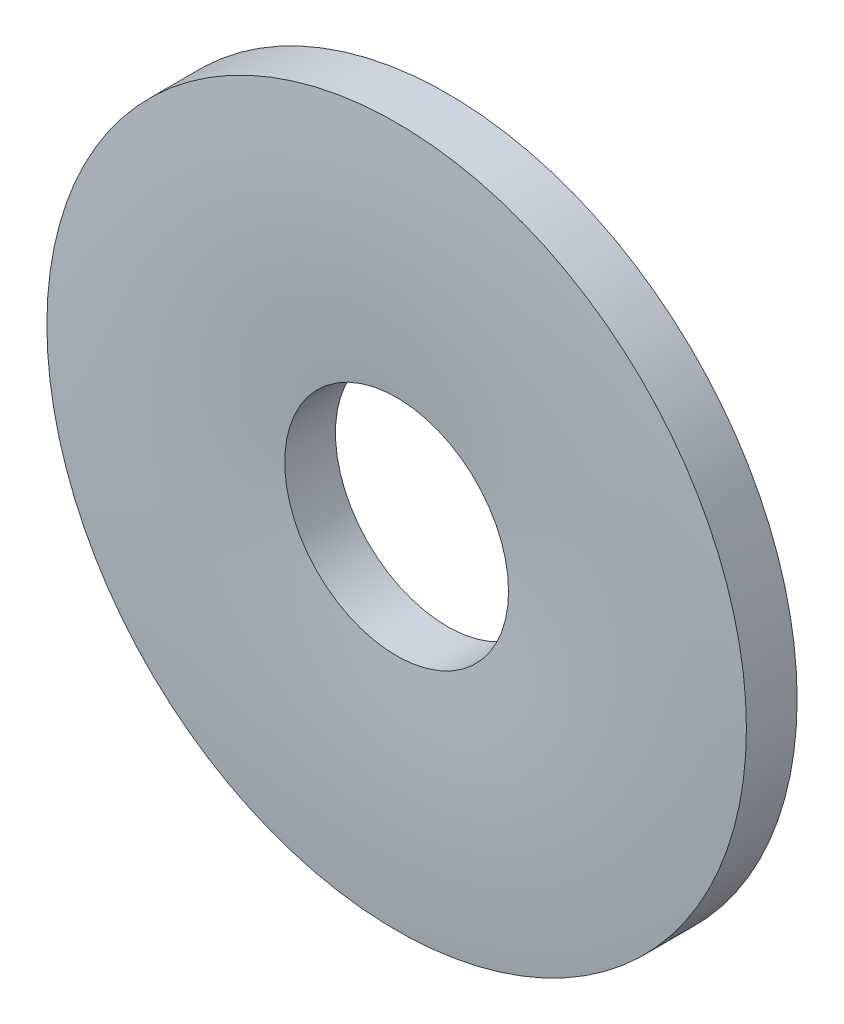
ISO-10303-21;
HEADER;
FILE_DESCRIPTION(('STEP AP214'),'2;1');
FILE_NAME('part.step','',(''),(''),'','','');
FILE_SCHEMA(('AUTOMOTIVE_DESIGN { 1 0 10303 214 1 1 1 1 }'));
ENDSEC;
DATA;
#1=APPLICATION_CONTEXT('core data for automotive mechanical design processes');
#2=APPLICATION_PROTOCOL_DEFINITION('international standard','automotive_design',2000,#1);
#3=PRODUCT_CONTEXT('',#1,'mechanical');
#4=PRODUCT('Part','Part','',(#3));
#5=PRODUCT_RELATED_PRODUCT_CATEGORY('part','',(#4));
#6=PRODUCT_DEFINITION_FORMATION('','',#4);
#7=PRODUCT_DEFINITION_CONTEXT('part definition',#1,'design');
#8=PRODUCT_DEFINITION('design','',#6,#7);
#9=PRODUCT_DEFINITION_SHAPE('','',#8);
#10=(LENGTH_UNIT() NAMED_UNIT(*) SI_UNIT(.MILLI.,.METRE.));
#11=(NAMED_UNIT(*) PLANE_ANGLE_UNIT() SI_UNIT($,.RADIAN.));
#12=(NAMED_UNIT(*) SI_UNIT($,.STERADIAN.) SOLID_ANGLE_UNIT());
#13=UNCERTAINTY_MEASURE_WITH_UNIT(LENGTH_MEASURE(1.E-05),#10,'distance_accuracy_value','');
#14=(GEOMETRIC_REPRESENTATION_CONTEXT(3) GLOBAL_UNCERTAINTY_ASSIGNED_CONTEXT((#13)) GLOBAL_UNIT_ASSIGNED_CONTEXT((#10,
#11,#12)) REPRESENTATION_CONTEXT('',''));
#15=CARTESIAN_POINT('',(0.,0.,0.));
#16=DIRECTION('',(0.,0.,1.));
#17=DIRECTION('',(1.,0.,0.));
#18=AXIS2_PLACEMENT_3D('',#15,#16,#17);
#19=CARTESIAN_POINT('',(0.,3.2,-0.799999999999999));
#20=DIRECTION('',(0.,0.,1.));
#21=DIRECTION('',(1.,0.,0.));
#22=AXIS2_PLACEMENT_3D('',#19,#20,#21);
#23=PLANE('',#22);
#24=CARTESIAN_POINT('',(0.,0.,-0.799999999999999));
#25=DIRECTION('',(0.,0.,1.));
#26=DIRECTION('',(1.,0.,0.));
#27=AXIS2_PLACEMENT_3D('',#24,#25,#26);
#28=CIRCLE('',#27,10.);
#29=CARTESIAN_POINT('',(10.,0.,-0.799999999999999));
#30=VERTEX_POINT('',#29);
#31=EDGE_CURVE('E54',#30,#30,#28,.T.);
#32=ORIENTED_EDGE('',*,*,#31,.F.);
#33=EDGE_LOOP('',(#32));
#34=FACE_BOUND('',#33,.T.);
#35=CARTESIAN_POINT('',(0.,0.,-0.8));
#36=DIRECTION('',(0.,0.,1.));
#37=DIRECTION('',(1.,0.,0.));
#38=AXIS2_PLACEMENT_3D('',#35,#36,#37);
#39=CIRCLE('',#38,3.2);
#40=CARTESIAN_POINT('',(3.2,0.,-0.8));
#41=VERTEX_POINT('',#40);
#42=EDGE_CURVE('E10',#41,#41,#39,.T.);
#43=ORIENTED_EDGE('',*,*,#42,.T.);
#44=EDGE_LOOP('',(#43));
#45=FACE_BOUND('',#44,.T.);
#46=ADVANCED_FACE('F37',(#34,#45),#23,.F.);
#47=CARTESIAN_POINT('',(0.,0.,0.8));
#48=DIRECTION('',(0.,0.,1.));
#49=DIRECTION('',(1.,0.,0.));
#50=AXIS2_PLACEMENT_3D('',#47,#48,#49);
#51=CYLINDRICAL_SURFACE('',#50,3.2);
#52=ORIENTED_EDGE('',*,*,#42,.F.);
#53=EDGE_LOOP('',(#52));
#54=FACE_BOUND('',#53,.T.);
#55=CARTESIAN_POINT('',(0.,0.,0.650079999999997));
#56=DIRECTION('',(0.,0.,1.));
#57=DIRECTION('',(1.,0.,0.));
#58=AXIS2_PLACEMENT_3D('',#55,#56,#57);
#59=CIRCLE('',#58,3.2);
#60=CARTESIAN_POINT('',(3.2,0.,0.650079999999997));
#61=VERTEX_POINT('',#60);
#62=EDGE_CURVE('E44',#61,#61,#59,.T.);
#63=ORIENTED_EDGE('',*,*,#62,.T.);
#64=EDGE_LOOP('',(#63));
#65=FACE_BOUND('',#64,.T.);
#66=ADVANCED_FACE('F64',(#54,#65),#51,.F.);
#67=CARTESIAN_POINT('',(0.,0.,-37.8288554108859));
#68=DIRECTION('',(0.,0.,1.));
#69=DIRECTION('',(1.,0.,0.));
#70=AXIS2_PLACEMENT_3D('',#67,#68,#69);
#71=DEGENERATE_TOROIDAL_SURFACE('',#70,6.6,38.6288554108859,.T.);
#72=ORIENTED_EDGE('',*,*,#62,.F.);
#73=EDGE_LOOP('',(#72));
#74=FACE_BOUND('',#73,.T.);
#75=CARTESIAN_POINT('',(0.,0.,0.650080000000001));
#76=DIRECTION('',(0.,0.,1.));
#77=DIRECTION('',(1.,0.,0.));
#78=AXIS2_PLACEMENT_3D('',#75,#76,#77);
#79=CIRCLE('',#78,10.);
#80=CARTESIAN_POINT('',(10.,0.,0.650080000000001));
#81=VERTEX_POINT('',#80);
#82=EDGE_CURVE('E49',#81,#81,#79,.T.);
#83=ORIENTED_EDGE('',*,*,#82,.T.);
#84=EDGE_LOOP('',(#83));
#85=FACE_BOUND('',#84,.T.);
#86=ADVANCED_FACE('F68',(#74,#85),#71,.T.);
#87=CARTESIAN_POINT('',(0.,0.,0.8));
#88=DIRECTION('',(0.,0.,1.));
#89=DIRECTION('',(1.,0.,0.));
#90=AXIS2_PLACEMENT_3D('',#87,#88,#89);
#91=CYLINDRICAL_SURFACE('',#90,10.);
#92=ORIENTED_EDGE('',*,*,#82,.F.);
#93=EDGE_LOOP('',(#92));
#94=FACE_BOUND('',#93,.T.);
#95=ORIENTED_EDGE('',*,*,#31,.T.);
#96=EDGE_LOOP('',(#95));
#97=FACE_BOUND('',#96,.T.);
#98=ADVANCED_FACE('F61',(#94,#97),#91,.T.);
#99=CLOSED_SHELL('',(#46,#66,#86,#98));
#100=MANIFOLD_SOLID_BREP('B2',#99);
#101=ADVANCED_BREP_SHAPE_REPRESENTATION('',(#18,#100),#14);
#102=SHAPE_DEFINITION_REPRESENTATION(#9,#101);
ENDSEC;
END-ISO-10303-21;
